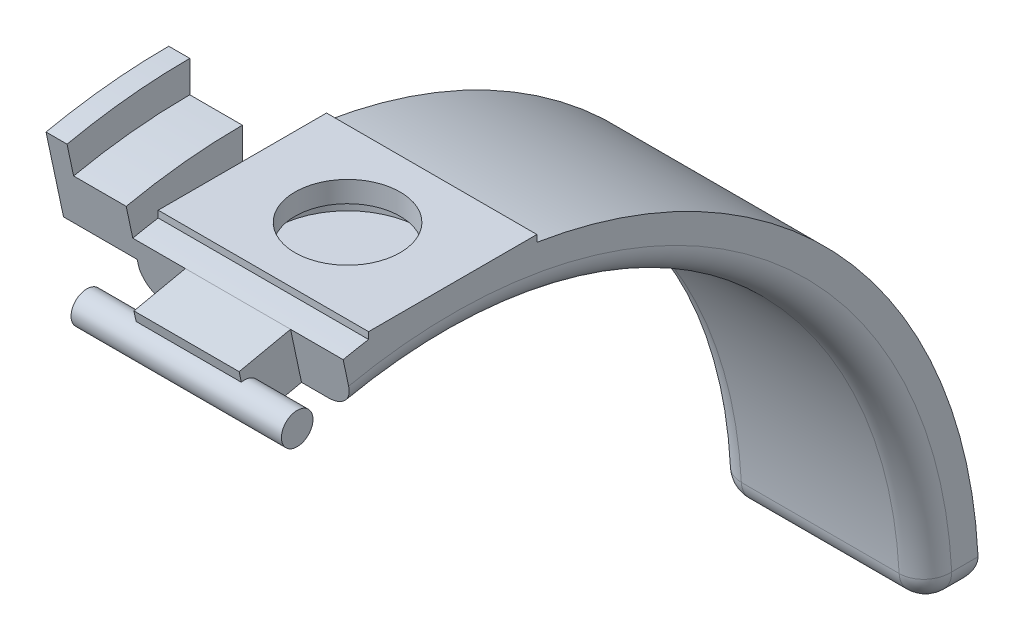
ISO-10303-21;
HEADER;
FILE_DESCRIPTION(('STEP AP214'),'2;1');
FILE_NAME('part.step','',(''),(''),'','','');
FILE_SCHEMA(('AUTOMOTIVE_DESIGN { 1 0 10303 214 1 1 1 1 }'));
ENDSEC;
DATA;
#1=APPLICATION_CONTEXT('core data for automotive mechanical design processes');
#2=APPLICATION_PROTOCOL_DEFINITION('international standard','automotive_design',2000,#1);
#3=PRODUCT_CONTEXT('',#1,'mechanical');
#4=PRODUCT('Part','Part','',(#3));
#5=PRODUCT_RELATED_PRODUCT_CATEGORY('part','',(#4));
#6=PRODUCT_DEFINITION_FORMATION('','',#4);
#7=PRODUCT_DEFINITION_CONTEXT('part definition',#1,'design');
#8=PRODUCT_DEFINITION('design','',#6,#7);
#9=PRODUCT_DEFINITION_SHAPE('','',#8);
#10=(LENGTH_UNIT() NAMED_UNIT(*) SI_UNIT(.MILLI.,.METRE.));
#11=(NAMED_UNIT(*) PLANE_ANGLE_UNIT() SI_UNIT($,.RADIAN.));
#12=(NAMED_UNIT(*) SI_UNIT($,.STERADIAN.) SOLID_ANGLE_UNIT());
#13=UNCERTAINTY_MEASURE_WITH_UNIT(LENGTH_MEASURE(1.E-05),#10,'distance_accuracy_value','');
#14=(GEOMETRIC_REPRESENTATION_CONTEXT(3) GLOBAL_UNCERTAINTY_ASSIGNED_CONTEXT((#13)) GLOBAL_UNIT_ASSIGNED_CONTEXT((#10,
#11,#12)) REPRESENTATION_CONTEXT('',''));
#15=CARTESIAN_POINT('',(0.,0.,0.));
#16=DIRECTION('',(0.,0.,1.));
#17=DIRECTION('',(1.,0.,0.));
#18=AXIS2_PLACEMENT_3D('',#15,#16,#17);
#19=CARTESIAN_POINT('',(0.,-1.04166666666667,4.89028941429396));
#20=DIRECTION('',(0.,-0.208333333333333,0.978057882858792));
#21=DIRECTION('',(0.,-0.978057882858792,-0.208333333333333));
#22=AXIS2_PLACEMENT_3D('',#19,#20,#21);
#23=PLANE('',#22);
#24=DIRECTION('',(0.,-0.978057882858792,-0.208333333333333));
#25=VECTOR('',#24,1.);
#26=CARTESIAN_POINT('',(15.,42.970938061979,14.265289414294));
#27=LINE('',#26,#25);
#28=CARTESIAN_POINT('',(15.,43.9489959448378,14.4736227476273));
#29=VERTEX_POINT('',#28);
#30=CARTESIAN_POINT('',(15.,42.970938061979,14.265289414294));
#31=VERTEX_POINT('',#30);
#32=EDGE_CURVE('E285',#29,#31,#27,.T.);
#33=ORIENTED_EDGE('',*,*,#32,.F.);
#34=DIRECTION('',(-1.,0.,0.));
#35=VECTOR('',#34,1.);
#36=CARTESIAN_POINT('',(10.,43.9489959448378,14.4736227476273));
#37=LINE('',#36,#35);
#38=CARTESIAN_POINT('',(5.,43.9489959448378,14.4736227476273));
#39=VERTEX_POINT('',#38);
#40=EDGE_CURVE('E355',#39,#29,#37,.F.);
#41=ORIENTED_EDGE('',*,*,#40,.F.);
#42=DIRECTION('',(0.,-0.978057882858792,-0.208333333333333));
#43=VECTOR('',#42,1.);
#44=CARTESIAN_POINT('',(5.,42.970938061979,14.265289414294));
#45=LINE('',#44,#43);
#46=CARTESIAN_POINT('',(5.,42.970938061979,14.265289414294));
#47=VERTEX_POINT('',#46);
#48=EDGE_CURVE('E304',#39,#47,#45,.T.);
#49=ORIENTED_EDGE('',*,*,#48,.T.);
#50=DIRECTION('',(1.,0.,0.));
#51=VECTOR('',#50,1.);
#52=CARTESIAN_POINT('',(10.,42.970938061979,14.265289414294));
#53=LINE('',#52,#51);
#54=EDGE_CURVE('E308',#47,#31,#53,.T.);
#55=ORIENTED_EDGE('',*,*,#54,.T.);
#56=EDGE_LOOP('',(#33,#41,#49,#55));
#57=FACE_BOUND('',#56,.T.);
#58=ADVANCED_FACE('F53',(#57),#23,.T.);
#59=DIRECTION('',(-1.,0.,0.));
#60=VECTOR('',#59,1.);
#61=CARTESIAN_POINT('',(10.,46.8831695934141,15.0986227476273));
#62=LINE('',#61,#60);
#63=CARTESIAN_POINT('',(15.,46.8831695934141,15.0986227476273));
#64=VERTEX_POINT('',#63);
#65=CARTESIAN_POINT('',(5.,46.8831695934141,15.0986227476273));
#66=VERTEX_POINT('',#65);
#67=EDGE_CURVE('E99',#64,#66,#62,.T.);
#68=ORIENTED_EDGE('',*,*,#67,.F.);
#69=CARTESIAN_POINT('',(15.,47.8612274762729,15.3069560809606));
#70=VERTEX_POINT('',#69);
#71=EDGE_CURVE('E288',#70,#64,#27,.T.);
#72=ORIENTED_EDGE('',*,*,#71,.F.);
#73=DIRECTION('',(-1.,0.,0.));
#74=VECTOR('',#73,1.);
#75=CARTESIAN_POINT('',(10.,47.8612274762729,15.3069560809606));
#76=LINE('',#75,#74);
#77=CARTESIAN_POINT('',(5.,47.8612274762729,15.3069560809606));
#78=VERTEX_POINT('',#77);
#79=EDGE_CURVE('E302',#70,#78,#76,.T.);
#80=ORIENTED_EDGE('',*,*,#79,.T.);
#81=EDGE_CURVE('E306',#78,#66,#45,.T.);
#82=ORIENTED_EDGE('',*,*,#81,.T.);
#83=EDGE_LOOP('',(#68,#72,#80,#82));
#84=FACE_BOUND('',#83,.T.);
#85=ADVANCED_FACE('F409',(#84),#23,.T.);
#86=CARTESIAN_POINT('',(15.,42.970938061979,14.265289414294));
#87=DIRECTION('',(1.,0.,0.));
#88=DIRECTION('',(0.,0.,-1.));
#89=AXIS2_PLACEMENT_3D('',#86,#87,#88);
#90=PLANE('',#89);
#91=ORIENTED_EDGE('',*,*,#71,.T.);
#92=CARTESIAN_POINT('',(15.,45.416082769126,14.7861227476273));
#93=DIRECTION('',(1.,0.,0.));
#94=DIRECTION('',(0.,0.,-1.));
#95=AXIS2_PLACEMENT_3D('',#92,#93,#94);
#96=CIRCLE('',#95,1.5);
#97=EDGE_CURVE('E358',#64,#29,#96,.F.);
#98=ORIENTED_EDGE('',*,*,#97,.T.);
#99=ORIENTED_EDGE('',*,*,#32,.T.);
#100=DIRECTION('',(0.,0.208333333333333,-0.978057882858792));
#101=VECTOR('',#100,1.);
#102=CARTESIAN_POINT('',(15.,42.970938061979,14.265289414294));
#103=LINE('',#102,#101);
#104=CARTESIAN_POINT('',(15.,44.0126047286457,9.37500000000001));
#105=VERTEX_POINT('',#104);
#106=EDGE_CURVE('E293',#31,#105,#103,.T.);
#107=ORIENTED_EDGE('',*,*,#106,.T.);
#108=DIRECTION('',(0.,-0.978057882858792,-0.208333333333333));
#109=VECTOR('',#108,1.);
#110=CARTESIAN_POINT('',(15.,44.0126047286457,9.37500000000001));
#111=LINE('',#110,#109);
#112=CARTESIAN_POINT('',(15.,48.9028941429396,10.4166666666667));
#113=VERTEX_POINT('',#112);
#114=EDGE_CURVE('E280',#113,#105,#111,.T.);
#115=ORIENTED_EDGE('',*,*,#114,.F.);
#116=DIRECTION('',(0.,0.208333333333333,-0.978057882858792));
#117=VECTOR('',#116,1.);
#118=CARTESIAN_POINT('',(15.,47.8612274762729,15.3069560809606));
#119=LINE('',#118,#117);
#120=EDGE_CURVE('E290',#70,#113,#119,.T.);
#121=ORIENTED_EDGE('',*,*,#120,.F.);
#122=EDGE_LOOP('',(#91,#98,#99,#107,#115,#121));
#123=FACE_BOUND('',#122,.T.);
#124=ADVANCED_FACE('F416',(#123),#90,.T.);
#125=CARTESIAN_POINT('',(-5.,46.946778377222,10.));
#126=DIRECTION('',(0.,0.208333333333333,-0.978057882858792));
#127=DIRECTION('',(0.,0.978057882858792,0.208333333333333));
#128=AXIS2_PLACEMENT_3D('',#125,#126,#127);
#129=PLANE('',#128);
#130=DIRECTION('',(-1.,0.,0.));
#131=VECTOR('',#130,1.);
#132=CARTESIAN_POINT('',(10.,44.0126047286456,9.375));
#133=LINE('',#132,#131);
#134=CARTESIAN_POINT('',(17.5,44.0126047286456,9.375));
#135=VERTEX_POINT('',#134);
#136=EDGE_CURVE('E837',#135,#105,#133,.T.);
#137=ORIENTED_EDGE('',*,*,#136,.F.);
#138=CARTESIAN_POINT('',(17.5,46.4577494357926,9.89583333333333));
#139=DIRECTION('',(0.,0.208333333333333,-0.978057882858792));
#140=DIRECTION('',(0.,0.978057882858792,0.208333333333333));
#141=AXIS2_PLACEMENT_3D('',#138,#139,#140);
#142=CIRCLE('',#141,2.5);
#143=CARTESIAN_POINT('',(20.,46.4577494357926,9.89583333333333));
#144=VERTEX_POINT('',#143);
#145=EDGE_CURVE('E12',#135,#144,#142,.F.);
#146=ORIENTED_EDGE('',*,*,#145,.T.);
#147=DIRECTION('',(0.,-0.978057882858792,-0.208333333333333));
#148=VECTOR('',#147,1.);
#149=CARTESIAN_POINT('',(20.,46.4577494357926,9.89583333333333));
#150=LINE('',#149,#148);
#151=CARTESIAN_POINT('',(20.,48.9028941429396,10.4166666666667));
#152=VERTEX_POINT('',#151);
#153=EDGE_CURVE('E834',#152,#144,#150,.T.);
#154=ORIENTED_EDGE('',*,*,#153,.F.);
#155=DIRECTION('',(1.,0.,0.));
#156=VECTOR('',#155,1.);
#157=CARTESIAN_POINT('',(10.,48.9028941429396,10.4166666666667));
#158=LINE('',#157,#156);
#159=EDGE_CURVE('E352',#113,#152,#158,.T.);
#160=ORIENTED_EDGE('',*,*,#159,.F.);
#161=ORIENTED_EDGE('',*,*,#114,.T.);
#162=EDGE_LOOP('',(#137,#146,#154,#160,#161));
#163=FACE_BOUND('',#162,.T.);
#164=ADVANCED_FACE('F470',(#163),#129,.F.);
#165=DIRECTION('',(0.,0.978057882858792,0.208333333333333));
#166=VECTOR('',#165,1.);
#167=CARTESIAN_POINT('',(0.,46.4577494357926,9.89583333333333));
#168=LINE('',#167,#166);
#169=CARTESIAN_POINT('',(0.,46.4577494357926,9.89583333333333));
#170=VERTEX_POINT('',#169);
#171=CARTESIAN_POINT('',(0.,46.946778377222,10.));
#172=VERTEX_POINT('',#171);
#173=EDGE_CURVE('E233',#170,#172,#168,.T.);
#174=ORIENTED_EDGE('',*,*,#173,.F.);
#175=CARTESIAN_POINT('',(2.5,46.4577494357926,9.89583333333333));
#176=DIRECTION('',(0.,0.208333333333333,-0.978057882858792));
#177=DIRECTION('',(0.,0.978057882858792,0.208333333333333));
#178=AXIS2_PLACEMENT_3D('',#175,#176,#177);
#179=CIRCLE('',#178,2.5);
#180=CARTESIAN_POINT('',(2.5,44.0126047286456,9.375));
#181=VERTEX_POINT('',#180);
#182=EDGE_CURVE('E63',#170,#181,#179,.F.);
#183=ORIENTED_EDGE('',*,*,#182,.T.);
#184=CARTESIAN_POINT('',(5.,44.0126047286456,9.375));
#185=VERTEX_POINT('',#184);
#186=EDGE_CURVE('E334',#185,#181,#133,.T.);
#187=ORIENTED_EDGE('',*,*,#186,.F.);
#188=DIRECTION('',(0.,-0.978057882858792,-0.208333333333333));
#189=VECTOR('',#188,1.);
#190=CARTESIAN_POINT('',(5.,44.0126047286457,9.37500000000001));
#191=LINE('',#190,#189);
#192=CARTESIAN_POINT('',(5.,48.9028941429396,10.4166666666667));
#193=VERTEX_POINT('',#192);
#194=EDGE_CURVE('E301',#193,#185,#191,.T.);
#195=ORIENTED_EDGE('',*,*,#194,.F.);
#196=CARTESIAN_POINT('',(0.,48.9028941429396,10.4166666666667));
#197=VERTEX_POINT('',#196);
#198=EDGE_CURVE('E330',#197,#193,#158,.T.);
#199=ORIENTED_EDGE('',*,*,#198,.F.);
#200=DIRECTION('',(0.,0.978057882858792,0.208333333333333));
#201=VECTOR('',#200,1.);
#202=CARTESIAN_POINT('',(0.,46.946778377222,10.));
#203=LINE('',#202,#201);
#204=CARTESIAN_POINT('',(0.,51.837067791516,11.0416666666667));
#205=VERTEX_POINT('',#204);
#206=EDGE_CURVE('E336',#197,#205,#203,.T.);
#207=ORIENTED_EDGE('',*,*,#206,.T.);
#208=DIRECTION('',(1.,0.,0.));
#209=VECTOR('',#208,1.);
#210=CARTESIAN_POINT('',(-5.,51.837067791516,11.0416666666667));
#211=LINE('',#210,#209);
#212=CARTESIAN_POINT('',(-5.,51.837067791516,11.0416666666667));
#213=VERTEX_POINT('',#212);
#214=EDGE_CURVE('E814',#213,#205,#211,.T.);
#215=ORIENTED_EDGE('',*,*,#214,.F.);
#216=DIRECTION('',(0.,0.978057882858792,0.208333333333333));
#217=VECTOR('',#216,1.);
#218=CARTESIAN_POINT('',(-5.,46.946778377222,10.));
#219=LINE('',#218,#217);
#220=CARTESIAN_POINT('',(-5.,54.7712414400924,11.6666666666667));
#221=VERTEX_POINT('',#220);
#222=EDGE_CURVE('E329',#213,#221,#219,.T.);
#223=ORIENTED_EDGE('',*,*,#222,.T.);
#224=DIRECTION('',(1.,0.,0.));
#225=VECTOR('',#224,1.);
#226=CARTESIAN_POINT('',(-7.,54.7712414400924,11.6666666666667));
#227=LINE('',#226,#225);
#228=CARTESIAN_POINT('',(-7.,54.7712414400924,11.6666666666667));
#229=VERTEX_POINT('',#228);
#230=EDGE_CURVE('E890',#229,#221,#227,.T.);
#231=ORIENTED_EDGE('',*,*,#230,.F.);
#232=DIRECTION('',(0.,0.978057882858792,0.208333333333333));
#233=VECTOR('',#232,1.);
#234=CARTESIAN_POINT('',(-7.,46.946778377222,10.));
#235=LINE('',#234,#233);
#236=CARTESIAN_POINT('',(-7.,46.946778377222,10.));
#237=VERTEX_POINT('',#236);
#238=EDGE_CURVE('E897',#237,#229,#235,.T.);
#239=ORIENTED_EDGE('',*,*,#238,.F.);
#240=DIRECTION('',(1.,0.,0.));
#241=VECTOR('',#240,1.);
#242=CARTESIAN_POINT('',(-5.,46.946778377222,10.));
#243=LINE('',#242,#241);
#244=EDGE_CURVE('E246',#237,#172,#243,.T.);
#245=ORIENTED_EDGE('',*,*,#244,.T.);
#246=EDGE_LOOP('',(#174,#183,#187,#195,#199,#207,#215,#223,#231,#239,#245));
#247=FACE_BOUND('',#246,.T.);
#248=ADVANCED_FACE('F242',(#247),#129,.F.);
#249=CARTESIAN_POINT('',(0.,0.,0.));
#250=DIRECTION('',(1.,0.,0.));
#251=DIRECTION('',(0.,0.,-1.));
#252=AXIS2_PLACEMENT_3D('',#249,#250,#251);
#253=PLANE('',#252);
#254=CARTESIAN_POINT('',(0.,0.,0.));
#255=DIRECTION('',(1.,0.,0.));
#256=DIRECTION('',(0.,0.,-1.));
#257=AXIS2_PLACEMENT_3D('',#254,#255,#256);
#258=CIRCLE('',#257,50.);
#259=CARTESIAN_POINT('',(0.,2.63157894736842,-49.9306998973955));
#260=VERTEX_POINT('',#259);
#261=CARTESIAN_POINT('',(0.,49.3558507170123,-8.));
#262=VERTEX_POINT('',#261);
#263=EDGE_CURVE('E380',#260,#262,#258,.T.);
#264=ORIENTED_EDGE('',*,*,#263,.F.);
#265=CARTESIAN_POINT('',(0.,2.5,-47.4341649025257));
#266=DIRECTION('',(1.,0.,0.));
#267=DIRECTION('',(0.,0.,-1.));
#268=AXIS2_PLACEMENT_3D('',#265,#266,#267);
#269=CIRCLE('',#268,2.5);
#270=CARTESIAN_POINT('',(0.,2.5,-49.9341649025257));
#271=VERTEX_POINT('',#270);
#272=EDGE_CURVE('E72',#260,#271,#269,.F.);
#273=ORIENTED_EDGE('',*,*,#272,.T.);
#274=DIRECTION('',(0.,0.,-1.));
#275=VECTOR('',#274,1.);
#276=CARTESIAN_POINT('',(0.,2.5,0.));
#277=LINE('',#276,#275);
#278=CARTESIAN_POINT('',(0.,2.5,-47.4341649025257));
#279=VERTEX_POINT('',#278);
#280=EDGE_CURVE('E235',#271,#279,#277,.F.);
#281=ORIENTED_EDGE('',*,*,#280,.T.);
#282=CARTESIAN_POINT('',(0.,0.,0.));
#283=DIRECTION('',(1.,0.,0.));
#284=DIRECTION('',(0.,0.,-1.));
#285=AXIS2_PLACEMENT_3D('',#282,#283,#284);
#286=CIRCLE('',#285,47.5);
#287=EDGE_CURVE('E230',#279,#170,#286,.T.);
#288=ORIENTED_EDGE('',*,*,#287,.T.);
#289=ORIENTED_EDGE('',*,*,#173,.T.);
#290=CARTESIAN_POINT('',(0.,0.,0.));
#291=DIRECTION('',(1.,0.,0.));
#292=DIRECTION('',(0.,0.,-1.));
#293=AXIS2_PLACEMENT_3D('',#290,#291,#292);
#294=CIRCLE('',#293,48.);
#295=CARTESIAN_POINT('',(0.,48.,0.));
#296=VERTEX_POINT('',#295);
#297=EDGE_CURVE('E321',#296,#172,#294,.T.);
#298=ORIENTED_EDGE('',*,*,#297,.F.);
#299=DIRECTION('',(0.,-1.,0.));
#300=VECTOR('',#299,1.);
#301=CARTESIAN_POINT('',(0.,53.,0.));
#302=LINE('',#301,#300);
#303=CARTESIAN_POINT('',(0.,50.,0.));
#304=VERTEX_POINT('',#303);
#305=EDGE_CURVE('E813',#304,#296,#302,.T.);
#306=ORIENTED_EDGE('',*,*,#305,.F.);
#307=DIRECTION('',(0.,0.,1.));
#308=VECTOR('',#307,1.);
#309=CARTESIAN_POINT('',(0.,50.,-8.));
#310=LINE('',#309,#308);
#311=CARTESIAN_POINT('',(0.,50.,-8.));
#312=VERTEX_POINT('',#311);
#313=EDGE_CURVE('E844',#312,#304,#310,.T.);
#314=ORIENTED_EDGE('',*,*,#313,.F.);
#315=DIRECTION('',(0.,1.,0.));
#316=VECTOR('',#315,1.);
#317=CARTESIAN_POINT('',(0.,45.,-8.));
#318=LINE('',#317,#316);
#319=EDGE_CURVE('E387',#262,#312,#318,.T.);
#320=ORIENTED_EDGE('',*,*,#319,.F.);
#321=EDGE_LOOP('',(#264,#273,#281,#288,#289,#298,#306,#314,#320));
#322=FACE_BOUND('',#321,.T.);
#323=ADVANCED_FACE('F232',(#322),#253,.F.);
#324=CARTESIAN_POINT('',(20.,0.,0.));
#325=DIRECTION('',(1.,0.,0.));
#326=DIRECTION('',(0.,0.,-1.));
#327=AXIS2_PLACEMENT_3D('',#324,#325,#326);
#328=PLANE('',#327);
#329=DIRECTION('',(0.,0.,-1.));
#330=VECTOR('',#329,1.);
#331=CARTESIAN_POINT('',(20.,2.5,-50.));
#332=LINE('',#331,#330);
#333=CARTESIAN_POINT('',(20.,2.5,-47.4341649025257));
#334=VERTEX_POINT('',#333);
#335=CARTESIAN_POINT('',(20.,2.5,-49.9341649025257));
#336=VERTEX_POINT('',#335);
#337=EDGE_CURVE('E371',#334,#336,#332,.T.);
#338=ORIENTED_EDGE('',*,*,#337,.T.);
#339=CARTESIAN_POINT('',(20.,2.5,-47.4341649025257));
#340=DIRECTION('',(1.,0.,0.));
#341=DIRECTION('',(0.,0.,-1.));
#342=AXIS2_PLACEMENT_3D('',#339,#340,#341);
#343=CIRCLE('',#342,2.5);
#344=CARTESIAN_POINT('',(20.,2.63157894736842,-49.9306998973955));
#345=VERTEX_POINT('',#344);
#346=EDGE_CURVE('E373',#336,#345,#343,.T.);
#347=ORIENTED_EDGE('',*,*,#346,.T.);
#348=CARTESIAN_POINT('',(20.,0.,0.));
#349=DIRECTION('',(1.,0.,0.));
#350=DIRECTION('',(0.,0.,-1.));
#351=AXIS2_PLACEMENT_3D('',#348,#349,#350);
#352=CIRCLE('',#351,50.);
#353=CARTESIAN_POINT('',(20.,49.3558507170123,-8.));
#354=VERTEX_POINT('',#353);
#355=EDGE_CURVE('E382',#345,#354,#352,.T.);
#356=ORIENTED_EDGE('',*,*,#355,.T.);
#357=DIRECTION('',(0.,1.,0.));
#358=VECTOR('',#357,1.);
#359=CARTESIAN_POINT('',(20.,45.,-8.));
#360=LINE('',#359,#358);
#361=CARTESIAN_POINT('',(20.,50.,-8.));
#362=VERTEX_POINT('',#361);
#363=EDGE_CURVE('E833',#354,#362,#360,.T.);
#364=ORIENTED_EDGE('',*,*,#363,.T.);
#365=DIRECTION('',(0.,0.,1.));
#366=VECTOR('',#365,1.);
#367=CARTESIAN_POINT('',(20.,50.,-8.));
#368=LINE('',#367,#366);
#369=CARTESIAN_POINT('',(20.,50.,8.));
#370=VERTEX_POINT('',#369);
#371=EDGE_CURVE('E855',#362,#370,#368,.T.);
#372=ORIENTED_EDGE('',*,*,#371,.T.);
#373=DIRECTION('',(0.,-1.,0.));
#374=VECTOR('',#373,1.);
#375=CARTESIAN_POINT('',(20.,50.,8.));
#376=LINE('',#375,#374);
#377=CARTESIAN_POINT('',(20.,49.3558507170123,8.));
#378=VERTEX_POINT('',#377);
#379=EDGE_CURVE('E388',#370,#378,#376,.T.);
#380=ORIENTED_EDGE('',*,*,#379,.T.);
#381=EDGE_CURVE('E248',#378,#152,#352,.T.);
#382=ORIENTED_EDGE('',*,*,#381,.T.);
#383=ORIENTED_EDGE('',*,*,#153,.T.);
#384=CARTESIAN_POINT('',(20.,0.,0.));
#385=DIRECTION('',(1.,0.,0.));
#386=DIRECTION('',(0.,0.,-1.));
#387=AXIS2_PLACEMENT_3D('',#384,#385,#386);
#388=CIRCLE('',#387,47.5);
#389=EDGE_CURVE('E369',#144,#334,#388,.F.);
#390=ORIENTED_EDGE('',*,*,#389,.T.);
#391=EDGE_LOOP('',(#338,#347,#356,#364,#372,#380,#382,#383,#390));
#392=FACE_BOUND('',#391,.T.);
#393=ADVANCED_FACE('F498',(#392),#328,.T.);
#394=CARTESIAN_POINT('',(20.,0.,0.));
#395=DIRECTION('',(-1.,0.,0.));
#396=DIRECTION('',(0.,0.,1.));
#397=AXIS2_PLACEMENT_3D('',#394,#395,#396);
#398=CYLINDRICAL_SURFACE('',#397,50.);
#399=ORIENTED_EDGE('',*,*,#355,.F.);
#400=DIRECTION('',(-1.,0.,0.));
#401=VECTOR('',#400,1.);
#402=CARTESIAN_POINT('',(20.,2.63157894736842,-49.9306998973955));
#403=LINE('',#402,#401);
#404=EDGE_CURVE('E239',#345,#260,#403,.T.);
#405=ORIENTED_EDGE('',*,*,#404,.T.);
#406=ORIENTED_EDGE('',*,*,#263,.T.);
#407=DIRECTION('',(-1.,0.,0.));
#408=VECTOR('',#407,1.);
#409=CARTESIAN_POINT('',(20.,49.3558507170123,-8.));
#410=LINE('',#409,#408);
#411=EDGE_CURVE('E835',#354,#262,#410,.T.);
#412=ORIENTED_EDGE('',*,*,#411,.F.);
#413=EDGE_LOOP('',(#399,#405,#406,#412));
#414=FACE_BOUND('',#413,.T.);
#415=ADVANCED_FACE('F378',(#414),#398,.T.);
#416=CARTESIAN_POINT('',(0.,49.3558507170123,8.));
#417=VERTEX_POINT('',#416);
#418=EDGE_CURVE('E360',#417,#197,#258,.T.);
#419=ORIENTED_EDGE('',*,*,#418,.T.);
#420=ORIENTED_EDGE('',*,*,#198,.T.);
#421=EDGE_CURVE('E335',#193,#113,#158,.T.);
#422=ORIENTED_EDGE('',*,*,#421,.T.);
#423=ORIENTED_EDGE('',*,*,#159,.T.);
#424=ORIENTED_EDGE('',*,*,#381,.F.);
#425=DIRECTION('',(-1.,0.,0.));
#426=VECTOR('',#425,1.);
#427=CARTESIAN_POINT('',(20.,49.3558507170123,8.));
#428=LINE('',#427,#426);
#429=EDGE_CURVE('E797',#417,#378,#428,.F.);
#430=ORIENTED_EDGE('',*,*,#429,.F.);
#431=EDGE_LOOP('',(#419,#420,#422,#423,#424,#430));
#432=FACE_BOUND('',#431,.T.);
#433=ADVANCED_FACE('F497',(#432),#398,.T.);
#434=CARTESIAN_POINT('',(20.,0.,0.));
#435=DIRECTION('',(-1.,0.,0.));
#436=DIRECTION('',(0.,0.,1.));
#437=AXIS2_PLACEMENT_3D('',#434,#435,#436);
#438=CYLINDRICAL_SURFACE('',#437,45.);
#439=ORIENTED_EDGE('',*,*,#186,.T.);
#440=CARTESIAN_POINT('',(2.5,0.,0.));
#441=DIRECTION('',(1.,0.,0.));
#442=DIRECTION('',(0.,0.,-1.));
#443=AXIS2_PLACEMENT_3D('',#440,#441,#442);
#444=CIRCLE('',#443,45.);
#445=CARTESIAN_POINT('',(2.5,2.36842105263158,-44.9376299076559));
#446=VERTEX_POINT('',#445);
#447=EDGE_CURVE('E253',#181,#446,#444,.F.);
#448=ORIENTED_EDGE('',*,*,#447,.T.);
#449=DIRECTION('',(-1.,0.,0.));
#450=VECTOR('',#449,1.);
#451=CARTESIAN_POINT('',(20.,2.36842105263158,-44.9376299076559));
#452=LINE('',#451,#450);
#453=CARTESIAN_POINT('',(17.5,2.36842105263158,-44.9376299076559));
#454=VERTEX_POINT('',#453);
#455=EDGE_CURVE('E365',#446,#454,#452,.F.);
#456=ORIENTED_EDGE('',*,*,#455,.T.);
#457=CARTESIAN_POINT('',(17.5,0.,0.));
#458=DIRECTION('',(1.,0.,0.));
#459=DIRECTION('',(0.,0.,-1.));
#460=AXIS2_PLACEMENT_3D('',#457,#458,#459);
#461=CIRCLE('',#460,45.);
#462=EDGE_CURVE('E363',#454,#135,#461,.T.);
#463=ORIENTED_EDGE('',*,*,#462,.T.);
#464=ORIENTED_EDGE('',*,*,#136,.T.);
#465=DIRECTION('',(1.,0.,0.));
#466=VECTOR('',#465,1.);
#467=CARTESIAN_POINT('',(10.,44.0126047286456,9.37500000000001));
#468=LINE('',#467,#466);
#469=EDGE_CURVE('E305',#185,#105,#468,.T.);
#470=ORIENTED_EDGE('',*,*,#469,.F.);
#471=EDGE_LOOP('',(#439,#448,#456,#463,#464,#470));
#472=FACE_BOUND('',#471,.T.);
#473=ADVANCED_FACE('F439',(#472),#438,.F.);
#474=CARTESIAN_POINT('',(20.,45.,-8.));
#475=DIRECTION('',(0.,0.,1.));
#476=DIRECTION('',(1.,0.,0.));
#477=AXIS2_PLACEMENT_3D('',#474,#475,#476);
#478=PLANE('',#477);
#479=ORIENTED_EDGE('',*,*,#363,.F.);
#480=ORIENTED_EDGE('',*,*,#411,.T.);
#481=ORIENTED_EDGE('',*,*,#319,.T.);
#482=DIRECTION('',(-1.,0.,0.));
#483=VECTOR('',#482,1.);
#484=CARTESIAN_POINT('',(20.,50.,-8.));
#485=LINE('',#484,#483);
#486=EDGE_CURVE('E841',#362,#312,#485,.T.);
#487=ORIENTED_EDGE('',*,*,#486,.F.);
#488=EDGE_LOOP('',(#479,#480,#481,#487));
#489=FACE_BOUND('',#488,.T.);
#490=ADVANCED_FACE('F435',(#489),#478,.F.);
#491=CARTESIAN_POINT('',(20.,50.,-8.));
#492=DIRECTION('',(0.,-1.,0.));
#493=DIRECTION('',(0.,0.,-1.));
#494=AXIS2_PLACEMENT_3D('',#491,#492,#493);
#495=PLANE('',#494);
#496=CARTESIAN_POINT('',(10.,50.,0.));
#497=DIRECTION('',(0.,1.,0.));
#498=DIRECTION('',(0.,0.,1.));
#499=AXIS2_PLACEMENT_3D('',#496,#497,#498);
#500=CIRCLE('',#499,5.);
#501=CARTESIAN_POINT('',(10.,50.,5.));
#502=VERTEX_POINT('',#501);
#503=EDGE_CURVE('E858',#502,#502,#500,.T.);
#504=ORIENTED_EDGE('',*,*,#503,.F.);
#505=EDGE_LOOP('',(#504));
#506=FACE_BOUND('',#505,.T.);
#507=DIRECTION('',(-1.,0.,0.));
#508=VECTOR('',#507,1.);
#509=CARTESIAN_POINT('',(20.,50.,8.));
#510=LINE('',#509,#508);
#511=CARTESIAN_POINT('',(0.,50.,8.));
#512=VERTEX_POINT('',#511);
#513=EDGE_CURVE('E839',#370,#512,#510,.T.);
#514=ORIENTED_EDGE('',*,*,#513,.F.);
#515=ORIENTED_EDGE('',*,*,#371,.F.);
#516=ORIENTED_EDGE('',*,*,#486,.T.);
#517=ORIENTED_EDGE('',*,*,#313,.T.);
#518=EDGE_CURVE('E849',#304,#512,#310,.T.);
#519=ORIENTED_EDGE('',*,*,#518,.T.);
#520=EDGE_LOOP('',(#514,#515,#516,#517,#519));
#521=FACE_BOUND('',#520,.T.);
#522=ADVANCED_FACE('F438',(#506,#521),#495,.F.);
#523=CARTESIAN_POINT('',(20.,50.,8.));
#524=DIRECTION('',(0.,0.,-1.));
#525=DIRECTION('',(-1.,0.,0.));
#526=AXIS2_PLACEMENT_3D('',#523,#524,#525);
#527=PLANE('',#526);
#528=DIRECTION('',(0.,-1.,0.));
#529=VECTOR('',#528,1.);
#530=CARTESIAN_POINT('',(0.,50.,8.));
#531=LINE('',#530,#529);
#532=EDGE_CURVE('E840',#512,#417,#531,.T.);
#533=ORIENTED_EDGE('',*,*,#532,.T.);
#534=ORIENTED_EDGE('',*,*,#429,.T.);
#535=ORIENTED_EDGE('',*,*,#379,.F.);
#536=ORIENTED_EDGE('',*,*,#513,.T.);
#537=EDGE_LOOP('',(#533,#534,#535,#536));
#538=FACE_BOUND('',#537,.T.);
#539=ADVANCED_FACE('F443',(#538),#527,.F.);
#540=CARTESIAN_POINT('',(10.,48.,0.));
#541=DIRECTION('',(0.,1.,0.));
#542=DIRECTION('',(0.,0.,1.));
#543=AXIS2_PLACEMENT_3D('',#540,#541,#542);
#544=CYLINDRICAL_SURFACE('',#543,5.);
#545=CARTESIAN_POINT('',(10.,48.,0.));
#546=DIRECTION('',(0.,1.,0.));
#547=DIRECTION('',(0.,0.,1.));
#548=AXIS2_PLACEMENT_3D('',#545,#546,#547);
#549=CIRCLE('',#548,5.);
#550=CARTESIAN_POINT('',(10.,48.,5.));
#551=VERTEX_POINT('',#550);
#552=EDGE_CURVE('E847',#551,#551,#549,.F.);
#553=ORIENTED_EDGE('',*,*,#552,.T.);
#554=EDGE_LOOP('',(#553));
#555=FACE_BOUND('',#554,.T.);
#556=ORIENTED_EDGE('',*,*,#503,.T.);
#557=EDGE_LOOP('',(#556));
#558=FACE_BOUND('',#557,.T.);
#559=ADVANCED_FACE('F447',(#555,#558),#544,.F.);
#560=CARTESIAN_POINT('',(10.,48.,0.));
#561=DIRECTION('',(0.,1.,0.));
#562=DIRECTION('',(0.,0.,1.));
#563=AXIS2_PLACEMENT_3D('',#560,#561,#562);
#564=PLANE('',#563);
#565=CARTESIAN_POINT('',(10.,48.,0.));
#566=DIRECTION('',(0.,1.,0.));
#567=DIRECTION('',(0.,0.,1.));
#568=AXIS2_PLACEMENT_3D('',#565,#566,#567);
#569=CIRCLE('',#568,7.);
#570=CARTESIAN_POINT('',(10.,48.,7.));
#571=VERTEX_POINT('',#570);
#572=EDGE_CURVE('E861',#571,#571,#569,.T.);
#573=ORIENTED_EDGE('',*,*,#572,.F.);
#574=EDGE_LOOP('',(#573));
#575=FACE_BOUND('',#574,.T.);
#576=ORIENTED_EDGE('',*,*,#552,.F.);
#577=EDGE_LOOP('',(#576));
#578=FACE_BOUND('',#577,.T.);
#579=ADVANCED_FACE('F451',(#575,#578),#564,.F.);
#580=CARTESIAN_POINT('',(10.,46.,0.));
#581=DIRECTION('',(0.,1.,0.));
#582=DIRECTION('',(0.,0.,1.));
#583=AXIS2_PLACEMENT_3D('',#580,#581,#582);
#584=CYLINDRICAL_SURFACE('',#583,7.);
#585=CARTESIAN_POINT('',(10.,46.,0.));
#586=DIRECTION('',(0.,1.,0.));
#587=DIRECTION('',(0.,0.,1.));
#588=AXIS2_PLACEMENT_3D('',#585,#586,#587);
#589=CIRCLE('',#588,7.);
#590=CARTESIAN_POINT('',(10.,46.,7.));
#591=VERTEX_POINT('',#590);
#592=EDGE_CURVE('E324',#591,#591,#589,.T.);
#593=ORIENTED_EDGE('',*,*,#592,.F.);
#594=EDGE_LOOP('',(#593));
#595=FACE_BOUND('',#594,.T.);
#596=ORIENTED_EDGE('',*,*,#572,.T.);
#597=EDGE_LOOP('',(#596));
#598=FACE_BOUND('',#597,.T.);
#599=ADVANCED_FACE('F453',(#595,#598),#584,.F.);
#600=CARTESIAN_POINT('',(10.,46.,0.));
#601=DIRECTION('',(0.,1.,0.));
#602=DIRECTION('',(0.,0.,1.));
#603=AXIS2_PLACEMENT_3D('',#600,#601,#602);
#604=PLANE('',#603);
#605=ORIENTED_EDGE('',*,*,#592,.T.);
#606=EDGE_LOOP('',(#605));
#607=FACE_BOUND('',#606,.T.);
#608=ADVANCED_FACE('F456',(#607),#604,.T.);
#609=CARTESIAN_POINT('',(0.,0.,0.));
#610=DIRECTION('',(1.,0.,0.));
#611=DIRECTION('',(0.,0.,-1.));
#612=AXIS2_PLACEMENT_3D('',#609,#610,#611);
#613=PLANE('',#612);
#614=ORIENTED_EDGE('',*,*,#418,.F.);
#615=ORIENTED_EDGE('',*,*,#532,.F.);
#616=ORIENTED_EDGE('',*,*,#518,.F.);
#617=CARTESIAN_POINT('',(0.,53.,0.));
#618=VERTEX_POINT('',#617);
#619=EDGE_CURVE('E810',#618,#304,#302,.T.);
#620=ORIENTED_EDGE('',*,*,#619,.F.);
#621=CARTESIAN_POINT('',(0.,0.,0.));
#622=DIRECTION('',(-1.,0.,0.));
#623=DIRECTION('',(0.,0.,1.));
#624=AXIS2_PLACEMENT_3D('',#621,#622,#623);
#625=CIRCLE('',#624,53.);
#626=EDGE_CURVE('E328',#205,#618,#625,.T.);
#627=ORIENTED_EDGE('',*,*,#626,.F.);
#628=ORIENTED_EDGE('',*,*,#206,.F.);
#629=EDGE_LOOP('',(#614,#615,#616,#620,#627,#628));
#630=FACE_BOUND('',#629,.T.);
#631=ADVANCED_FACE('F463',(#630),#613,.T.);
#632=CARTESIAN_POINT('',(-5.,0.,0.));
#633=DIRECTION('',(1.,0.,0.));
#634=DIRECTION('',(0.,0.,-1.));
#635=AXIS2_PLACEMENT_3D('',#632,#633,#634);
#636=CYLINDRICAL_SURFACE('',#635,48.);
#637=ORIENTED_EDGE('',*,*,#297,.T.);
#638=ORIENTED_EDGE('',*,*,#244,.F.);
#639=CARTESIAN_POINT('',(-7.,0.,0.));
#640=DIRECTION('',(1.,0.,0.));
#641=DIRECTION('',(0.,0.,-1.));
#642=AXIS2_PLACEMENT_3D('',#639,#640,#641);
#643=CIRCLE('',#642,48.);
#644=CARTESIAN_POINT('',(-7.,48.,0.));
#645=VERTEX_POINT('',#644);
#646=EDGE_CURVE('E894',#645,#237,#643,.T.);
#647=ORIENTED_EDGE('',*,*,#646,.F.);
#648=DIRECTION('',(1.,0.,0.));
#649=VECTOR('',#648,1.);
#650=CARTESIAN_POINT('',(-5.,48.,0.));
#651=LINE('',#650,#649);
#652=EDGE_CURVE('E323',#645,#296,#651,.T.);
#653=ORIENTED_EDGE('',*,*,#652,.T.);
#654=EDGE_LOOP('',(#637,#638,#647,#653));
#655=FACE_BOUND('',#654,.T.);
#656=ADVANCED_FACE('F465',(#655),#636,.F.);
#657=CARTESIAN_POINT('',(-5.,0.,0.));
#658=DIRECTION('',(1.,0.,0.));
#659=DIRECTION('',(0.,0.,-1.));
#660=AXIS2_PLACEMENT_3D('',#657,#658,#659);
#661=CYLINDRICAL_SURFACE('',#660,53.);
#662=ORIENTED_EDGE('',*,*,#626,.T.);
#663=DIRECTION('',(1.,0.,0.));
#664=VECTOR('',#663,1.);
#665=CARTESIAN_POINT('',(-5.,53.,0.));
#666=LINE('',#665,#664);
#667=CARTESIAN_POINT('',(-5.,53.,0.));
#668=VERTEX_POINT('',#667);
#669=EDGE_CURVE('E826',#668,#618,#666,.T.);
#670=ORIENTED_EDGE('',*,*,#669,.F.);
#671=CARTESIAN_POINT('',(-5.,0.,0.));
#672=DIRECTION('',(-1.,0.,0.));
#673=DIRECTION('',(0.,0.,1.));
#674=AXIS2_PLACEMENT_3D('',#671,#672,#673);
#675=CIRCLE('',#674,53.);
#676=EDGE_CURVE('E357',#213,#668,#675,.T.);
#677=ORIENTED_EDGE('',*,*,#676,.F.);
#678=ORIENTED_EDGE('',*,*,#214,.T.);
#679=EDGE_LOOP('',(#662,#670,#677,#678));
#680=FACE_BOUND('',#679,.T.);
#681=ADVANCED_FACE('F468',(#680),#661,.T.);
#682=CARTESIAN_POINT('',(-5.,53.,0.));
#683=DIRECTION('',(0.,0.,1.));
#684=DIRECTION('',(1.,0.,0.));
#685=AXIS2_PLACEMENT_3D('',#682,#683,#684);
#686=PLANE('',#685);
#687=ORIENTED_EDGE('',*,*,#619,.T.);
#688=ORIENTED_EDGE('',*,*,#305,.T.);
#689=ORIENTED_EDGE('',*,*,#652,.F.);
#690=DIRECTION('',(0.,-1.,0.));
#691=VECTOR('',#690,1.);
#692=CARTESIAN_POINT('',(-7.,56.,0.));
#693=LINE('',#692,#691);
#694=CARTESIAN_POINT('',(-7.,56.,0.));
#695=VERTEX_POINT('',#694);
#696=EDGE_CURVE('E823',#695,#645,#693,.T.);
#697=ORIENTED_EDGE('',*,*,#696,.F.);
#698=DIRECTION('',(1.,0.,0.));
#699=VECTOR('',#698,1.);
#700=CARTESIAN_POINT('',(-7.,56.,0.));
#701=LINE('',#700,#699);
#702=CARTESIAN_POINT('',(-5.,56.,0.));
#703=VERTEX_POINT('',#702);
#704=EDGE_CURVE('E902',#695,#703,#701,.T.);
#705=ORIENTED_EDGE('',*,*,#704,.T.);
#706=DIRECTION('',(0.,-1.,0.));
#707=VECTOR('',#706,1.);
#708=CARTESIAN_POINT('',(-5.,56.,0.));
#709=LINE('',#708,#707);
#710=EDGE_CURVE('E829',#703,#668,#709,.T.);
#711=ORIENTED_EDGE('',*,*,#710,.T.);
#712=ORIENTED_EDGE('',*,*,#669,.T.);
#713=EDGE_LOOP('',(#687,#688,#689,#697,#705,#711,#712));
#714=FACE_BOUND('',#713,.T.);
#715=ADVANCED_FACE('F476',(#714),#686,.F.);
#716=CARTESIAN_POINT('',(-7.,0.,0.));
#717=DIRECTION('',(1.,0.,0.));
#718=DIRECTION('',(0.,0.,-1.));
#719=AXIS2_PLACEMENT_3D('',#716,#717,#718);
#720=CYLINDRICAL_SURFACE('',#719,56.);
#721=CARTESIAN_POINT('',(-5.,0.,0.));
#722=DIRECTION('',(-1.,0.,0.));
#723=DIRECTION('',(0.,0.,1.));
#724=AXIS2_PLACEMENT_3D('',#721,#722,#723);
#725=CIRCLE('',#724,56.);
#726=EDGE_CURVE('E828',#221,#703,#725,.T.);
#727=ORIENTED_EDGE('',*,*,#726,.T.);
#728=ORIENTED_EDGE('',*,*,#704,.F.);
#729=CARTESIAN_POINT('',(-7.,0.,0.));
#730=DIRECTION('',(-1.,0.,0.));
#731=DIRECTION('',(0.,0.,1.));
#732=AXIS2_PLACEMENT_3D('',#729,#730,#731);
#733=CIRCLE('',#732,56.);
#734=EDGE_CURVE('E893',#229,#695,#733,.T.);
#735=ORIENTED_EDGE('',*,*,#734,.F.);
#736=ORIENTED_EDGE('',*,*,#230,.T.);
#737=EDGE_LOOP('',(#727,#728,#735,#736));
#738=FACE_BOUND('',#737,.T.);
#739=ADVANCED_FACE('F480',(#738),#720,.T.);
#740=CARTESIAN_POINT('',(-7.,0.,0.));
#741=DIRECTION('',(1.,0.,0.));
#742=DIRECTION('',(0.,0.,-1.));
#743=AXIS2_PLACEMENT_3D('',#740,#741,#742);
#744=PLANE('',#743);
#745=ORIENTED_EDGE('',*,*,#646,.T.);
#746=ORIENTED_EDGE('',*,*,#238,.T.);
#747=ORIENTED_EDGE('',*,*,#734,.T.);
#748=ORIENTED_EDGE('',*,*,#696,.T.);
#749=EDGE_LOOP('',(#745,#746,#747,#748));
#750=FACE_BOUND('',#749,.T.);
#751=ADVANCED_FACE('F487',(#750),#744,.F.);
#752=CARTESIAN_POINT('',(-5.,0.,0.));
#753=DIRECTION('',(1.,0.,0.));
#754=DIRECTION('',(0.,0.,-1.));
#755=AXIS2_PLACEMENT_3D('',#752,#753,#754);
#756=PLANE('',#755);
#757=ORIENTED_EDGE('',*,*,#222,.F.);
#758=ORIENTED_EDGE('',*,*,#676,.T.);
#759=ORIENTED_EDGE('',*,*,#710,.F.);
#760=ORIENTED_EDGE('',*,*,#726,.F.);
#761=EDGE_LOOP('',(#757,#758,#759,#760));
#762=FACE_BOUND('',#761,.T.);
#763=ADVANCED_FACE('F433',(#762),#756,.T.);
#764=CARTESIAN_POINT('',(10.,47.8612274762729,15.3069560809606));
#765=DIRECTION('',(0.,-0.978057882858792,-0.208333333333333));
#766=DIRECTION('',(0.,0.208333333333333,-0.978057882858792));
#767=AXIS2_PLACEMENT_3D('',#764,#765,#766);
#768=PLANE('',#767);
#769=ORIENTED_EDGE('',*,*,#421,.F.);
#770=DIRECTION('',(0.,0.208333333333333,-0.978057882858792));
#771=VECTOR('',#770,1.);
#772=CARTESIAN_POINT('',(5.,47.8612274762729,15.3069560809606));
#773=LINE('',#772,#771);
#774=EDGE_CURVE('E249',#78,#193,#773,.T.);
#775=ORIENTED_EDGE('',*,*,#774,.F.);
#776=ORIENTED_EDGE('',*,*,#79,.F.);
#777=ORIENTED_EDGE('',*,*,#120,.T.);
#778=EDGE_LOOP('',(#769,#775,#776,#777));
#779=FACE_BOUND('',#778,.T.);
#780=ADVANCED_FACE('F429',(#779),#768,.F.);
#781=CARTESIAN_POINT('',(5.,42.970938061979,14.265289414294));
#782=DIRECTION('',(1.,0.,0.));
#783=DIRECTION('',(0.,0.,-1.));
#784=AXIS2_PLACEMENT_3D('',#781,#782,#783);
#785=PLANE('',#784);
#786=ORIENTED_EDGE('',*,*,#48,.F.);
#787=CARTESIAN_POINT('',(5.,45.416082769126,14.7861227476273));
#788=DIRECTION('',(1.,0.,0.));
#789=DIRECTION('',(0.,0.,-1.));
#790=AXIS2_PLACEMENT_3D('',#787,#788,#789);
#791=CIRCLE('',#790,1.5);
#792=EDGE_CURVE('E299',#39,#66,#791,.T.);
#793=ORIENTED_EDGE('',*,*,#792,.T.);
#794=ORIENTED_EDGE('',*,*,#81,.F.);
#795=ORIENTED_EDGE('',*,*,#774,.T.);
#796=ORIENTED_EDGE('',*,*,#194,.T.);
#797=DIRECTION('',(0.,0.208333333333333,-0.978057882858792));
#798=VECTOR('',#797,1.);
#799=CARTESIAN_POINT('',(5.,42.970938061979,14.265289414294));
#800=LINE('',#799,#798);
#801=EDGE_CURVE('E311',#47,#185,#800,.T.);
#802=ORIENTED_EDGE('',*,*,#801,.F.);
#803=EDGE_LOOP('',(#786,#793,#794,#795,#796,#802));
#804=FACE_BOUND('',#803,.T.);
#805=ADVANCED_FACE('F425',(#804),#785,.F.);
#806=CARTESIAN_POINT('',(10.,42.970938061979,14.265289414294));
#807=DIRECTION('',(0.,0.978057882858792,0.208333333333333));
#808=DIRECTION('',(0.,-0.208333333333333,0.978057882858792));
#809=AXIS2_PLACEMENT_3D('',#806,#807,#808);
#810=PLANE('',#809);
#811=ORIENTED_EDGE('',*,*,#469,.T.);
#812=ORIENTED_EDGE('',*,*,#106,.F.);
#813=ORIENTED_EDGE('',*,*,#54,.F.);
#814=ORIENTED_EDGE('',*,*,#801,.T.);
#815=EDGE_LOOP('',(#811,#812,#813,#814));
#816=FACE_BOUND('',#815,.T.);
#817=ADVANCED_FACE('F422',(#816),#810,.F.);
#818=CARTESIAN_POINT('',(10.,45.416082769126,14.7861227476273));
#819=DIRECTION('',(-1.,0.,0.));
#820=DIRECTION('',(0.,0.,1.));
#821=AXIS2_PLACEMENT_3D('',#818,#819,#820);
#822=CYLINDRICAL_SURFACE('',#821,1.5);
#823=ORIENTED_EDGE('',*,*,#40,.T.);
#824=ORIENTED_EDGE('',*,*,#97,.F.);
#825=ORIENTED_EDGE('',*,*,#67,.T.);
#826=ORIENTED_EDGE('',*,*,#792,.F.);
#827=EDGE_LOOP('',(#823,#824,#825,#826));
#828=FACE_BOUND('',#827,.T.);
#829=CARTESIAN_POINT('',(0.,45.416082769126,14.7861227476273));
#830=DIRECTION('',(-1.,0.,0.));
#831=DIRECTION('',(0.,0.,1.));
#832=AXIS2_PLACEMENT_3D('',#829,#830,#831);
#833=CIRCLE('',#832,1.5);
#834=CARTESIAN_POINT('',(0.,45.416082769126,16.2861227476273));
#835=VERTEX_POINT('',#834);
#836=EDGE_CURVE('E296',#835,#835,#833,.T.);
#837=ORIENTED_EDGE('',*,*,#836,.F.);
#838=EDGE_LOOP('',(#837));
#839=FACE_BOUND('',#838,.T.);
#840=CARTESIAN_POINT('',(20.,45.416082769126,14.7861227476273));
#841=DIRECTION('',(-1.,0.,0.));
#842=DIRECTION('',(0.,0.,1.));
#843=AXIS2_PLACEMENT_3D('',#840,#841,#842);
#844=CIRCLE('',#843,1.5);
#845=CARTESIAN_POINT('',(20.,45.416082769126,16.2861227476273));
#846=VERTEX_POINT('',#845);
#847=EDGE_CURVE('E276',#846,#846,#844,.T.);
#848=ORIENTED_EDGE('',*,*,#847,.T.);
#849=EDGE_LOOP('',(#848));
#850=FACE_BOUND('',#849,.T.);
#851=ADVANCED_FACE('F420',(#828,#839,#850),#822,.T.);
#852=CARTESIAN_POINT('',(0.,45.416082769126,14.7861227476273));
#853=DIRECTION('',(-1.,0.,0.));
#854=DIRECTION('',(0.,0.,1.));
#855=AXIS2_PLACEMENT_3D('',#852,#853,#854);
#856=PLANE('',#855);
#857=ORIENTED_EDGE('',*,*,#836,.T.);
#858=EDGE_LOOP('',(#857));
#859=FACE_BOUND('',#858,.T.);
#860=ADVANCED_FACE('F567',(#859),#856,.T.);
#861=CARTESIAN_POINT('',(20.,45.416082769126,14.7861227476273));
#862=DIRECTION('',(1.,0.,0.));
#863=DIRECTION('',(0.,0.,1.));
#864=AXIS2_PLACEMENT_3D('',#861,#862,#863);
#865=PLANE('',#864);
#866=ORIENTED_EDGE('',*,*,#847,.F.);
#867=EDGE_LOOP('',(#866));
#868=FACE_BOUND('',#867,.T.);
#869=ADVANCED_FACE('F559',(#868),#865,.T.);
#870=CARTESIAN_POINT('',(17.5,0.,0.));
#871=DIRECTION('',(1.,0.,0.));
#872=DIRECTION('',(0.,0.,-1.));
#873=AXIS2_PLACEMENT_3D('',#870,#871,#872);
#874=TOROIDAL_SURFACE('',#873,47.5,2.5);
#875=ORIENTED_EDGE('',*,*,#145,.F.);
#876=ORIENTED_EDGE('',*,*,#462,.F.);
#877=CARTESIAN_POINT('',(17.5,2.5,-47.4341649025257));
#878=DIRECTION('',(0.,-0.998613997947909,-0.0526315789473684));
#879=DIRECTION('',(0.,0.0526315789473684,-0.998613997947909));
#880=AXIS2_PLACEMENT_3D('',#877,#878,#879);
#881=CIRCLE('',#880,2.5);
#882=EDGE_CURVE('E57',#334,#454,#881,.T.);
#883=ORIENTED_EDGE('',*,*,#882,.F.);
#884=ORIENTED_EDGE('',*,*,#389,.F.);
#885=EDGE_LOOP('',(#875,#876,#883,#884));
#886=FACE_BOUND('',#885,.T.);
#887=ADVANCED_FACE('F55',(#886),#874,.T.);
#888=CARTESIAN_POINT('',(17.5,2.5,0.));
#889=DIRECTION('',(0.,0.,1.));
#890=DIRECTION('',(1.,0.,0.));
#891=AXIS2_PLACEMENT_3D('',#888,#889,#890);
#892=CYLINDRICAL_SURFACE('',#891,2.5);
#893=CARTESIAN_POINT('',(17.5,2.5,-47.4341649025257));
#894=DIRECTION('',(-0.707106781186547,0.,-0.707106781186547));
#895=DIRECTION('',(-0.707106781186547,0.,0.707106781186547));
#896=AXIS2_PLACEMENT_3D('',#893,#894,#895);
#897=ELLIPSE('',#896,3.53553390593274,2.5);
#898=CARTESIAN_POINT('',(17.5,0.,-47.4341649025257));
#899=VERTEX_POINT('',#898);
#900=EDGE_CURVE('E272',#336,#899,#897,.T.);
#901=ORIENTED_EDGE('',*,*,#900,.F.);
#902=ORIENTED_EDGE('',*,*,#337,.F.);
#903=CARTESIAN_POINT('',(17.5,2.5,-47.4341649025257));
#904=DIRECTION('',(0.,0.,1.));
#905=DIRECTION('',(1.,0.,0.));
#906=AXIS2_PLACEMENT_3D('',#903,#904,#905);
#907=CIRCLE('',#906,2.5);
#908=EDGE_CURVE('E90',#899,#334,#907,.T.);
#909=ORIENTED_EDGE('',*,*,#908,.F.);
#910=EDGE_LOOP('',(#901,#902,#909));
#911=FACE_BOUND('',#910,.T.);
#912=ADVANCED_FACE('F400',(#911),#892,.T.);
#913=CARTESIAN_POINT('',(2.5,2.5,-45.));
#914=DIRECTION('',(0.,0.,-1.));
#915=DIRECTION('',(-1.,0.,0.));
#916=AXIS2_PLACEMENT_3D('',#913,#914,#915);
#917=CYLINDRICAL_SURFACE('',#916,2.5);
#918=CARTESIAN_POINT('',(2.5,2.5,-47.4341649025257));
#919=DIRECTION('',(0.,0.,1.));
#920=DIRECTION('',(1.,0.,0.));
#921=AXIS2_PLACEMENT_3D('',#918,#919,#920);
#922=CIRCLE('',#921,2.5);
#923=CARTESIAN_POINT('',(2.5,0.,-47.4341649025257));
#924=VERTEX_POINT('',#923);
#925=EDGE_CURVE('E269',#279,#924,#922,.T.);
#926=ORIENTED_EDGE('',*,*,#925,.F.);
#927=ORIENTED_EDGE('',*,*,#280,.F.);
#928=CARTESIAN_POINT('',(2.5,2.5,-47.4341649025257));
#929=DIRECTION('',(0.707106781186547,0.,-0.707106781186547));
#930=DIRECTION('',(-0.707106781186547,0.,-0.707106781186547));
#931=AXIS2_PLACEMENT_3D('',#928,#929,#930);
#932=ELLIPSE('',#931,3.53553390593274,2.5);
#933=EDGE_CURVE('E82',#924,#271,#932,.T.);
#934=ORIENTED_EDGE('',*,*,#933,.F.);
#935=EDGE_LOOP('',(#926,#927,#934));
#936=FACE_BOUND('',#935,.T.);
#937=ADVANCED_FACE('F398',(#936),#917,.T.);
#938=CARTESIAN_POINT('',(2.5,0.,0.));
#939=DIRECTION('',(1.,0.,0.));
#940=DIRECTION('',(0.,0.,-1.));
#941=AXIS2_PLACEMENT_3D('',#938,#939,#940);
#942=TOROIDAL_SURFACE('',#941,47.5,2.5);
#943=ORIENTED_EDGE('',*,*,#182,.F.);
#944=ORIENTED_EDGE('',*,*,#287,.F.);
#945=CARTESIAN_POINT('',(2.5,2.5,-47.4341649025257));
#946=DIRECTION('',(0.,-0.998613997947909,-0.0526315789473684));
#947=DIRECTION('',(0.,0.0526315789473684,-0.998613997947909));
#948=AXIS2_PLACEMENT_3D('',#945,#946,#947);
#949=CIRCLE('',#948,2.5);
#950=EDGE_CURVE('E266',#446,#279,#949,.T.);
#951=ORIENTED_EDGE('',*,*,#950,.F.);
#952=ORIENTED_EDGE('',*,*,#447,.F.);
#953=EDGE_LOOP('',(#943,#944,#951,#952));
#954=FACE_BOUND('',#953,.T.);
#955=ADVANCED_FACE('F252',(#954),#942,.T.);
#956=CARTESIAN_POINT('',(17.5,2.5,-47.4341649025257));
#957=DIRECTION('',(0.,0.,1.));
#958=DIRECTION('',(1.,0.,0.));
#959=AXIS2_PLACEMENT_3D('',#956,#957,#958);
#960=SPHERICAL_SURFACE('',#959,2.5);
#961=ORIENTED_EDGE('',*,*,#908,.T.);
#962=ORIENTED_EDGE('',*,*,#882,.T.);
#963=CARTESIAN_POINT('',(17.5,2.5,-47.4341649025257));
#964=DIRECTION('',(1.,0.,0.));
#965=DIRECTION('',(0.,0.,-1.));
#966=AXIS2_PLACEMENT_3D('',#963,#964,#965);
#967=CIRCLE('',#966,2.5);
#968=EDGE_CURVE('E264',#899,#454,#967,.F.);
#969=ORIENTED_EDGE('',*,*,#968,.F.);
#970=EDGE_LOOP('',(#961,#962,#969));
#971=FACE_BOUND('',#970,.T.);
#972=ADVANCED_FACE('F406',(#971),#960,.T.);
#973=CARTESIAN_POINT('',(20.,2.5,-47.4341649025257));
#974=DIRECTION('',(-1.,0.,0.));
#975=DIRECTION('',(0.,0.,1.));
#976=AXIS2_PLACEMENT_3D('',#973,#974,#975);
#977=CYLINDRICAL_SURFACE('',#976,2.5);
#978=ORIENTED_EDGE('',*,*,#346,.F.);
#979=ORIENTED_EDGE('',*,*,#900,.T.);
#980=DIRECTION('',(-1.,0.,0.));
#981=VECTOR('',#980,1.);
#982=CARTESIAN_POINT('',(20.,0.,-47.4341649025257));
#983=LINE('',#982,#981);
#984=EDGE_CURVE('E261',#924,#899,#983,.F.);
#985=ORIENTED_EDGE('',*,*,#984,.F.);
#986=ORIENTED_EDGE('',*,*,#933,.T.);
#987=ORIENTED_EDGE('',*,*,#272,.F.);
#988=ORIENTED_EDGE('',*,*,#404,.F.);
#989=EDGE_LOOP('',(#978,#979,#985,#986,#987,#988));
#990=FACE_BOUND('',#989,.T.);
#991=ADVANCED_FACE('F390',(#990),#977,.T.);
#992=CARTESIAN_POINT('',(2.5,2.5,-47.4341649025257));
#993=DIRECTION('',(0.,0.,1.));
#994=DIRECTION('',(1.,0.,0.));
#995=AXIS2_PLACEMENT_3D('',#992,#993,#994);
#996=SPHERICAL_SURFACE('',#995,2.5);
#997=ORIENTED_EDGE('',*,*,#950,.T.);
#998=ORIENTED_EDGE('',*,*,#925,.T.);
#999=CARTESIAN_POINT('',(2.5,2.5,-47.4341649025257));
#1000=DIRECTION('',(-1.,0.,0.));
#1001=DIRECTION('',(0.,0.,1.));
#1002=AXIS2_PLACEMENT_3D('',#999,#1000,#1001);
#1003=CIRCLE('',#1002,2.5);
#1004=EDGE_CURVE('E258',#446,#924,#1003,.F.);
#1005=ORIENTED_EDGE('',*,*,#1004,.F.);
#1006=EDGE_LOOP('',(#997,#998,#1005));
#1007=FACE_BOUND('',#1006,.T.);
#1008=ADVANCED_FACE('F397',(#1007),#996,.T.);
#1009=CARTESIAN_POINT('',(20.,2.5,-47.4341649025257));
#1010=DIRECTION('',(-1.,0.,0.));
#1011=DIRECTION('',(0.,0.,1.));
#1012=AXIS2_PLACEMENT_3D('',#1009,#1010,#1011);
#1013=CYLINDRICAL_SURFACE('',#1012,2.5);
#1014=ORIENTED_EDGE('',*,*,#968,.T.);
#1015=ORIENTED_EDGE('',*,*,#455,.F.);
#1016=ORIENTED_EDGE('',*,*,#1004,.T.);
#1017=ORIENTED_EDGE('',*,*,#984,.T.);
#1018=EDGE_LOOP('',(#1014,#1015,#1016,#1017));
#1019=FACE_BOUND('',#1018,.T.);
#1020=ADVANCED_FACE('F395',(#1019),#1013,.T.);
#1021=CLOSED_SHELL('',(#58,#85,#124,#164,#248,#323,#393,#415,#433,#473,#490,#522,#539,#559,#579,
#599,#608,#631,#656,#681,#715,#739,#751,#763,#780,#805,#817,#851,#860,#869,#887,#912,#937,#955,
#972,#991,#1008,#1020));
#1022=MANIFOLD_SOLID_BREP('B2',#1021);
#1023=ADVANCED_BREP_SHAPE_REPRESENTATION('',(#18,#1022),#14);
#1024=SHAPE_DEFINITION_REPRESENTATION(#9,#1023);
ENDSEC;
END-ISO-10303-21;
